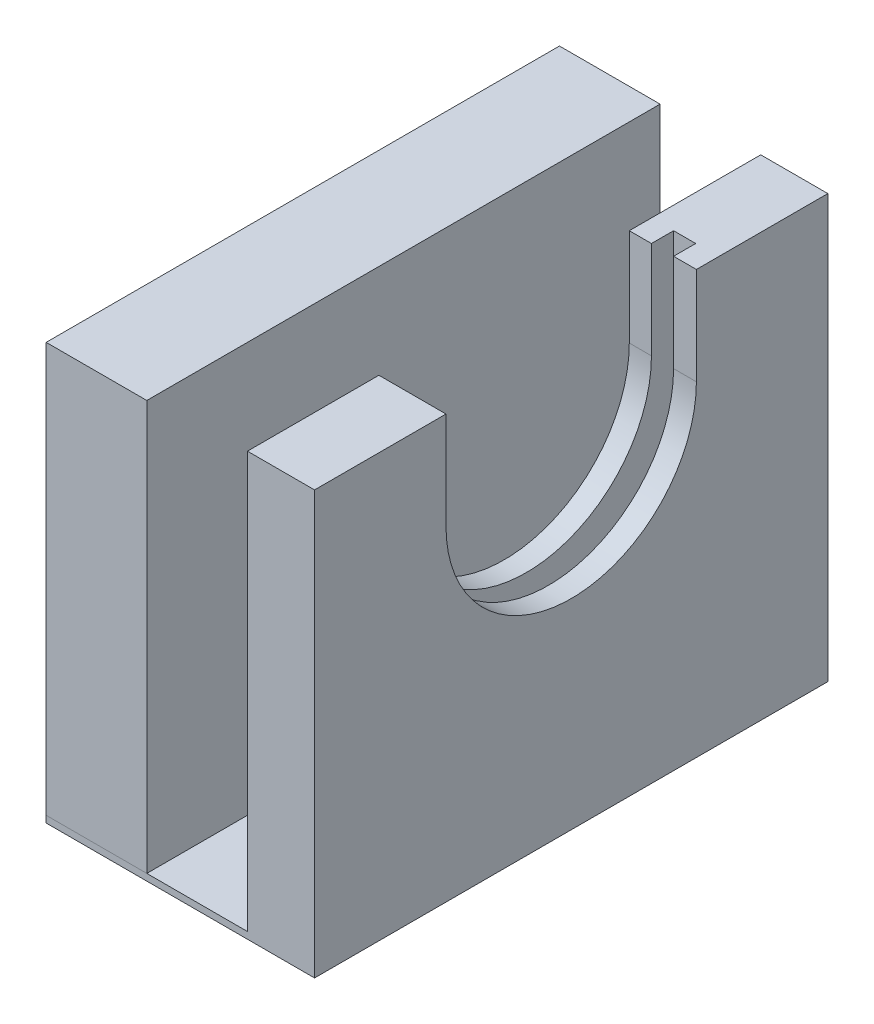
ISO-10303-21;
HEADER;
FILE_DESCRIPTION(('STEP AP214'),'2;1');
FILE_NAME('part.step','',(''),(''),'','','');
FILE_SCHEMA(('AUTOMOTIVE_DESIGN { 1 0 10303 214 1 1 1 1 }'));
ENDSEC;
DATA;
#1=APPLICATION_CONTEXT('core data for automotive mechanical design processes');
#2=APPLICATION_PROTOCOL_DEFINITION('international standard','automotive_design',2000,#1);
#3=PRODUCT_CONTEXT('',#1,'mechanical');
#4=PRODUCT('Part','Part','',(#3));
#5=PRODUCT_RELATED_PRODUCT_CATEGORY('part','',(#4));
#6=PRODUCT_DEFINITION_FORMATION('','',#4);
#7=PRODUCT_DEFINITION_CONTEXT('part definition',#1,'design');
#8=PRODUCT_DEFINITION('design','',#6,#7);
#9=PRODUCT_DEFINITION_SHAPE('','',#8);
#10=(LENGTH_UNIT() NAMED_UNIT(*) SI_UNIT(.MILLI.,.METRE.));
#11=(NAMED_UNIT(*) PLANE_ANGLE_UNIT() SI_UNIT($,.RADIAN.));
#12=(NAMED_UNIT(*) SI_UNIT($,.STERADIAN.) SOLID_ANGLE_UNIT());
#13=UNCERTAINTY_MEASURE_WITH_UNIT(LENGTH_MEASURE(1.E-05),#10,'distance_accuracy_value','');
#14=(GEOMETRIC_REPRESENTATION_CONTEXT(3) GLOBAL_UNCERTAINTY_ASSIGNED_CONTEXT((#13)) GLOBAL_UNIT_ASSIGNED_CONTEXT((#10,
#11,#12)) REPRESENTATION_CONTEXT('',''));
#15=CARTESIAN_POINT('',(0.,0.,0.));
#16=DIRECTION('',(0.,0.,1.));
#17=DIRECTION('',(1.,0.,0.));
#18=AXIS2_PLACEMENT_3D('',#15,#16,#17);
#19=CARTESIAN_POINT('',(-30.,0.,0.));
#20=DIRECTION('',(0.,-1.,0.));
#21=DIRECTION('',(0.,0.,-1.));
#22=AXIS2_PLACEMENT_3D('',#19,#20,#21);
#23=PLANE('',#22);
#24=DIRECTION('',(1.,0.,0.));
#25=VECTOR('',#24,1.);
#26=CARTESIAN_POINT('',(-30.,0.,76.5));
#27=LINE('',#26,#25);
#28=CARTESIAN_POINT('',(-30.,0.,76.5));
#29=VERTEX_POINT('',#28);
#30=CARTESIAN_POINT('',(-15.,0.,76.5));
#31=VERTEX_POINT('',#30);
#32=EDGE_CURVE('E108',#29,#31,#27,.T.);
#33=ORIENTED_EDGE('',*,*,#32,.F.);
#34=DIRECTION('',(0.,0.,1.));
#35=VECTOR('',#34,1.);
#36=CARTESIAN_POINT('',(-30.,0.,0.));
#37=LINE('',#36,#35);
#38=CARTESIAN_POINT('',(-30.,0.,0.));
#39=VERTEX_POINT('',#38);
#40=EDGE_CURVE('E12',#39,#29,#37,.T.);
#41=ORIENTED_EDGE('',*,*,#40,.F.);
#42=DIRECTION('',(1.,0.,0.));
#43=VECTOR('',#42,1.);
#44=CARTESIAN_POINT('',(-30.,0.,0.));
#45=LINE('',#44,#43);
#46=CARTESIAN_POINT('',(-15.,0.,0.));
#47=VERTEX_POINT('',#46);
#48=EDGE_CURVE('E102',#39,#47,#45,.T.);
#49=ORIENTED_EDGE('',*,*,#48,.T.);
#50=DIRECTION('',(0.,0.,1.));
#51=VECTOR('',#50,1.);
#52=CARTESIAN_POINT('',(-15.,0.,0.));
#53=LINE('',#52,#51);
#54=EDGE_CURVE('E47',#47,#31,#53,.T.);
#55=ORIENTED_EDGE('',*,*,#54,.T.);
#56=EDGE_LOOP('',(#33,#41,#49,#55));
#57=FACE_BOUND('',#56,.T.);
#58=ADVANCED_FACE('F44',(#57),#23,.T.);
#59=CARTESIAN_POINT('',(-30.,0.,0.));
#60=DIRECTION('',(-1.,0.,0.));
#61=DIRECTION('',(0.,0.,1.));
#62=AXIS2_PLACEMENT_3D('',#59,#60,#61);
#63=PLANE('',#62);
#64=DIRECTION('',(0.,-1.,0.));
#65=VECTOR('',#64,1.);
#66=CARTESIAN_POINT('',(-30.,0.,76.5));
#67=LINE('',#66,#65);
#68=CARTESIAN_POINT('',(-30.,61.0451591527197,76.5));
#69=VERTEX_POINT('',#68);
#70=EDGE_CURVE('E104',#69,#29,#67,.T.);
#71=ORIENTED_EDGE('',*,*,#70,.F.);
#72=DIRECTION('',(0.,0.,1.));
#73=VECTOR('',#72,1.);
#74=CARTESIAN_POINT('',(-30.,61.0451591527197,0.));
#75=LINE('',#74,#73);
#76=CARTESIAN_POINT('',(-30.,61.0451591527197,0.));
#77=VERTEX_POINT('',#76);
#78=EDGE_CURVE('E53',#77,#69,#75,.T.);
#79=ORIENTED_EDGE('',*,*,#78,.F.);
#80=DIRECTION('',(0.,-1.,0.));
#81=VECTOR('',#80,1.);
#82=CARTESIAN_POINT('',(-30.,0.,0.));
#83=LINE('',#82,#81);
#84=EDGE_CURVE('E99',#77,#39,#83,.T.);
#85=ORIENTED_EDGE('',*,*,#84,.T.);
#86=ORIENTED_EDGE('',*,*,#40,.T.);
#87=EDGE_LOOP('',(#71,#79,#85,#86));
#88=FACE_BOUND('',#87,.T.);
#89=ADVANCED_FACE('F118',(#88),#63,.T.);
#90=CARTESIAN_POINT('',(-30.,61.0451591527197,0.));
#91=DIRECTION('',(0.,1.,0.));
#92=DIRECTION('',(0.,0.,1.));
#93=AXIS2_PLACEMENT_3D('',#90,#91,#92);
#94=PLANE('',#93);
#95=DIRECTION('',(-1.,0.,0.));
#96=VECTOR('',#95,1.);
#97=CARTESIAN_POINT('',(-30.,61.0451591527197,76.5));
#98=LINE('',#97,#96);
#99=CARTESIAN_POINT('',(-15.,61.0451591527197,76.5));
#100=VERTEX_POINT('',#99);
#101=EDGE_CURVE('E94',#100,#69,#98,.T.);
#102=ORIENTED_EDGE('',*,*,#101,.F.);
#103=DIRECTION('',(0.,0.,1.));
#104=VECTOR('',#103,1.);
#105=CARTESIAN_POINT('',(-15.,61.0451591527197,0.));
#106=LINE('',#105,#104);
#107=CARTESIAN_POINT('',(-15.,61.0451591527197,0.));
#108=VERTEX_POINT('',#107);
#109=EDGE_CURVE('E89',#108,#100,#106,.T.);
#110=ORIENTED_EDGE('',*,*,#109,.F.);
#111=DIRECTION('',(-1.,0.,0.));
#112=VECTOR('',#111,1.);
#113=CARTESIAN_POINT('',(-30.,61.0451591527197,0.));
#114=LINE('',#113,#112);
#115=EDGE_CURVE('E92',#108,#77,#114,.T.);
#116=ORIENTED_EDGE('',*,*,#115,.T.);
#117=ORIENTED_EDGE('',*,*,#78,.T.);
#118=EDGE_LOOP('',(#102,#110,#116,#117));
#119=FACE_BOUND('',#118,.T.);
#120=ADVANCED_FACE('F91',(#119),#94,.T.);
#121=CARTESIAN_POINT('',(-15.,0.,0.));
#122=DIRECTION('',(1.,0.,0.));
#123=DIRECTION('',(0.,0.,-1.));
#124=AXIS2_PLACEMENT_3D('',#121,#122,#123);
#125=PLANE('',#124);
#126=DIRECTION('',(0.,1.,0.));
#127=VECTOR('',#126,1.);
#128=CARTESIAN_POINT('',(-15.,0.,76.5));
#129=LINE('',#128,#127);
#130=EDGE_CURVE('E111',#31,#100,#129,.T.);
#131=ORIENTED_EDGE('',*,*,#130,.F.);
#132=ORIENTED_EDGE('',*,*,#54,.F.);
#133=DIRECTION('',(0.,1.,0.));
#134=VECTOR('',#133,1.);
#135=CARTESIAN_POINT('',(-15.,0.,0.));
#136=LINE('',#135,#134);
#137=EDGE_CURVE('E98',#47,#108,#136,.T.);
#138=ORIENTED_EDGE('',*,*,#137,.T.);
#139=ORIENTED_EDGE('',*,*,#109,.T.);
#140=EDGE_LOOP('',(#131,#132,#138,#139));
#141=FACE_BOUND('',#140,.T.);
#142=ADVANCED_FACE('F101',(#141),#125,.T.);
#143=CARTESIAN_POINT('',(-15.,0.,0.));
#144=DIRECTION('',(0.,0.,1.));
#145=DIRECTION('',(1.,0.,0.));
#146=AXIS2_PLACEMENT_3D('',#143,#144,#145);
#147=PLANE('',#146);
#148=ORIENTED_EDGE('',*,*,#48,.F.);
#149=ORIENTED_EDGE('',*,*,#84,.F.);
#150=ORIENTED_EDGE('',*,*,#115,.F.);
#151=ORIENTED_EDGE('',*,*,#137,.F.);
#152=EDGE_LOOP('',(#148,#149,#150,#151));
#153=FACE_BOUND('',#152,.T.);
#154=ADVANCED_FACE('F97',(#153),#147,.F.);
#155=CARTESIAN_POINT('',(-15.,0.,76.5));
#156=DIRECTION('',(0.,0.,1.));
#157=DIRECTION('',(1.,0.,0.));
#158=AXIS2_PLACEMENT_3D('',#155,#156,#157);
#159=PLANE('',#158);
#160=ORIENTED_EDGE('',*,*,#32,.T.);
#161=ORIENTED_EDGE('',*,*,#130,.T.);
#162=ORIENTED_EDGE('',*,*,#101,.T.);
#163=ORIENTED_EDGE('',*,*,#70,.T.);
#164=EDGE_LOOP('',(#160,#161,#162,#163));
#165=FACE_BOUND('',#164,.T.);
#166=ADVANCED_FACE('F117',(#165),#159,.T.);
#167=CLOSED_SHELL('',(#58,#89,#120,#142,#154,#166));
#168=MANIFOLD_SOLID_BREP('B2',#167);
#169=CARTESIAN_POINT('',(-66.5,62.,19.59));
#170=DIRECTION('',(0.,0.,-1.));
#171=DIRECTION('',(0.,1.,0.));
#172=AXIS2_PLACEMENT_3D('',#169,#170,#171);
#173=PLANE('',#172);
#174=DIRECTION('',(1.,0.,0.));
#175=VECTOR('',#174,1.);
#176=CARTESIAN_POINT('',(-66.5,47.5,19.59));
#177=LINE('',#176,#175);
#178=CARTESIAN_POINT('',(0.,47.5,19.59));
#179=VERTEX_POINT('',#178);
#180=CARTESIAN_POINT('',(3.3,47.5,19.59));
#181=VERTEX_POINT('',#180);
#182=EDGE_CURVE('E193',#179,#181,#177,.T.);
#183=ORIENTED_EDGE('',*,*,#182,.T.);
#184=DIRECTION('',(0.,1.,0.));
#185=VECTOR('',#184,1.);
#186=CARTESIAN_POINT('',(3.3,62.,19.59));
#187=LINE('',#186,#185);
#188=CARTESIAN_POINT('',(3.3,62.,19.59));
#189=VERTEX_POINT('',#188);
#190=EDGE_CURVE('E357',#181,#189,#187,.T.);
#191=ORIENTED_EDGE('',*,*,#190,.T.);
#192=DIRECTION('',(1.,0.,0.));
#193=VECTOR('',#192,1.);
#194=CARTESIAN_POINT('',(-66.5,62.,19.59));
#195=LINE('',#194,#193);
#196=CARTESIAN_POINT('',(0.,62.,19.59));
#197=VERTEX_POINT('',#196);
#198=EDGE_CURVE('E373',#197,#189,#195,.T.);
#199=ORIENTED_EDGE('',*,*,#198,.F.);
#200=DIRECTION('',(0.,1.,0.));
#201=VECTOR('',#200,1.);
#202=CARTESIAN_POINT('',(0.,0.,19.59));
#203=LINE('',#202,#201);
#204=EDGE_CURVE('E429',#179,#197,#203,.T.);
#205=ORIENTED_EDGE('',*,*,#204,.F.);
#206=EDGE_LOOP('',(#183,#191,#199,#205));
#207=FACE_BOUND('',#206,.T.);
#208=ADVANCED_FACE('F169',(#207),#173,.F.);
#209=CARTESIAN_POINT('',(-66.5,47.5,38.25));
#210=DIRECTION('',(1.,0.,0.));
#211=DIRECTION('',(0.,0.,-1.));
#212=AXIS2_PLACEMENT_3D('',#209,#210,#211);
#213=CYLINDRICAL_SURFACE('',#212,18.66);
#214=DIRECTION('',(1.,0.,0.));
#215=VECTOR('',#214,1.);
#216=CARTESIAN_POINT('',(-66.5,47.5,56.91));
#217=LINE('',#216,#215);
#218=CARTESIAN_POINT('',(0.,47.5,56.91));
#219=VERTEX_POINT('',#218);
#220=CARTESIAN_POINT('',(3.3,47.5,56.91));
#221=VERTEX_POINT('',#220);
#222=EDGE_CURVE('E379',#219,#221,#217,.T.);
#223=ORIENTED_EDGE('',*,*,#222,.T.);
#224=CARTESIAN_POINT('',(3.3,47.5,38.25));
#225=DIRECTION('',(-1.,0.,0.));
#226=DIRECTION('',(0.,0.,1.));
#227=AXIS2_PLACEMENT_3D('',#224,#225,#226);
#228=CIRCLE('',#227,18.66);
#229=EDGE_CURVE('E42',#221,#181,#228,.F.);
#230=ORIENTED_EDGE('',*,*,#229,.T.);
#231=ORIENTED_EDGE('',*,*,#182,.F.);
#232=CARTESIAN_POINT('',(0.,47.5,38.25));
#233=DIRECTION('',(1.,0.,0.));
#234=DIRECTION('',(0.,0.,-1.));
#235=AXIS2_PLACEMENT_3D('',#232,#233,#234);
#236=CIRCLE('',#235,18.66);
#237=EDGE_CURVE('E425',#219,#179,#236,.T.);
#238=ORIENTED_EDGE('',*,*,#237,.F.);
#239=EDGE_LOOP('',(#223,#230,#231,#238));
#240=FACE_BOUND('',#239,.T.);
#241=ADVANCED_FACE('F446',(#240),#213,.F.);
#242=CARTESIAN_POINT('',(0.,62.,76.5));
#243=DIRECTION('',(0.,-1.,0.));
#244=DIRECTION('',(0.,0.,-1.));
#245=AXIS2_PLACEMENT_3D('',#242,#243,#244);
#246=PLANE('',#245);
#247=DIRECTION('',(0.,0.,-1.));
#248=VECTOR('',#247,1.);
#249=CARTESIAN_POINT('',(10.,62.,76.5));
#250=LINE('',#249,#248);
#251=CARTESIAN_POINT('',(10.,62.,76.5));
#252=VERTEX_POINT('',#251);
#253=CARTESIAN_POINT('',(10.,62.,56.91));
#254=VERTEX_POINT('',#253);
#255=EDGE_CURVE('E292',#252,#254,#250,.T.);
#256=ORIENTED_EDGE('',*,*,#255,.T.);
#257=DIRECTION('',(1.,0.,0.));
#258=VECTOR('',#257,1.);
#259=CARTESIAN_POINT('',(-66.5,62.,56.91));
#260=LINE('',#259,#258);
#261=CARTESIAN_POINT('',(0.,62.,56.91));
#262=VERTEX_POINT('',#261);
#263=EDGE_CURVE('E370',#262,#254,#260,.T.);
#264=ORIENTED_EDGE('',*,*,#263,.F.);
#265=DIRECTION('',(0.,0.,-1.));
#266=VECTOR('',#265,1.);
#267=CARTESIAN_POINT('',(0.,62.,76.5));
#268=LINE('',#267,#266);
#269=CARTESIAN_POINT('',(0.,62.,76.5));
#270=VERTEX_POINT('',#269);
#271=EDGE_CURVE('E390',#270,#262,#268,.T.);
#272=ORIENTED_EDGE('',*,*,#271,.F.);
#273=DIRECTION('',(-1.,0.,0.));
#274=VECTOR('',#273,1.);
#275=CARTESIAN_POINT('',(0.,62.,76.5));
#276=LINE('',#275,#274);
#277=EDGE_CURVE('E295',#252,#270,#276,.T.);
#278=ORIENTED_EDGE('',*,*,#277,.F.);
#279=EDGE_LOOP('',(#256,#264,#272,#278));
#280=FACE_BOUND('',#279,.T.);
#281=ADVANCED_FACE('F443',(#280),#246,.F.);
#282=CARTESIAN_POINT('',(10.,62.,76.5));
#283=DIRECTION('',(-1.,0.,0.));
#284=DIRECTION('',(0.,0.,1.));
#285=AXIS2_PLACEMENT_3D('',#282,#283,#284);
#286=PLANE('',#285);
#287=CARTESIAN_POINT('',(10.,47.5,38.25));
#288=DIRECTION('',(1.,0.,0.));
#289=DIRECTION('',(0.,0.,-1.));
#290=AXIS2_PLACEMENT_3D('',#287,#288,#289);
#291=CIRCLE('',#290,18.66);
#292=CARTESIAN_POINT('',(10.,47.5,56.91));
#293=VERTEX_POINT('',#292);
#294=CARTESIAN_POINT('',(10.,47.5,19.59));
#295=VERTEX_POINT('',#294);
#296=EDGE_CURVE('E363',#293,#295,#291,.T.);
#297=ORIENTED_EDGE('',*,*,#296,.F.);
#298=DIRECTION('',(0.,-1.,0.));
#299=VECTOR('',#298,1.);
#300=CARTESIAN_POINT('',(10.,62.,56.91));
#301=LINE('',#300,#299);
#302=EDGE_CURVE('E360',#254,#293,#301,.T.);
#303=ORIENTED_EDGE('',*,*,#302,.F.);
#304=ORIENTED_EDGE('',*,*,#255,.F.);
#305=DIRECTION('',(0.,1.,0.));
#306=VECTOR('',#305,1.);
#307=CARTESIAN_POINT('',(10.,62.,76.5));
#308=LINE('',#307,#306);
#309=CARTESIAN_POINT('',(10.,-1.,76.5));
#310=VERTEX_POINT('',#309);
#311=EDGE_CURVE('E284',#310,#252,#308,.T.);
#312=ORIENTED_EDGE('',*,*,#311,.F.);
#313=DIRECTION('',(0.,0.,1.));
#314=VECTOR('',#313,1.);
#315=CARTESIAN_POINT('',(10.,-1.,76.5));
#316=LINE('',#315,#314);
#317=CARTESIAN_POINT('',(10.,-1.,0.));
#318=VERTEX_POINT('',#317);
#319=EDGE_CURVE('E289',#318,#310,#316,.T.);
#320=ORIENTED_EDGE('',*,*,#319,.F.);
#321=DIRECTION('',(0.,1.,0.));
#322=VECTOR('',#321,1.);
#323=CARTESIAN_POINT('',(10.,62.,0.));
#324=LINE('',#323,#322);
#325=CARTESIAN_POINT('',(10.,62.,0.));
#326=VERTEX_POINT('',#325);
#327=EDGE_CURVE('E372',#318,#326,#324,.T.);
#328=ORIENTED_EDGE('',*,*,#327,.T.);
#329=CARTESIAN_POINT('',(10.,62.,19.59));
#330=VERTEX_POINT('',#329);
#331=EDGE_CURVE('E423',#330,#326,#250,.T.);
#332=ORIENTED_EDGE('',*,*,#331,.F.);
#333=DIRECTION('',(0.,1.,0.));
#334=VECTOR('',#333,1.);
#335=CARTESIAN_POINT('',(10.,62.,19.59));
#336=LINE('',#335,#334);
#337=EDGE_CURVE('E366',#295,#330,#336,.T.);
#338=ORIENTED_EDGE('',*,*,#337,.F.);
#339=EDGE_LOOP('',(#297,#303,#304,#312,#320,#328,#332,#338));
#340=FACE_BOUND('',#339,.T.);
#341=ADVANCED_FACE('F171',(#340),#286,.F.);
#342=ORIENTED_EDGE('',*,*,#198,.T.);
#343=DIRECTION('',(0.,0.,1.));
#344=VECTOR('',#343,1.);
#345=CARTESIAN_POINT('',(3.3,62.,46.395));
#346=LINE('',#345,#344);
#347=CARTESIAN_POINT('',(3.3,62.,16.29));
#348=VERTEX_POINT('',#347);
#349=EDGE_CURVE('E327',#348,#189,#346,.T.);
#350=ORIENTED_EDGE('',*,*,#349,.F.);
#351=DIRECTION('',(-1.,0.,0.));
#352=VECTOR('',#351,1.);
#353=CARTESIAN_POINT('',(-42.6153371469112,62.,16.29));
#354=LINE('',#353,#352);
#355=CARTESIAN_POINT('',(6.60000000000001,62.,16.29));
#356=VERTEX_POINT('',#355);
#357=EDGE_CURVE('E330',#356,#348,#354,.T.);
#358=ORIENTED_EDGE('',*,*,#357,.F.);
#359=DIRECTION('',(0.,0.,-1.));
#360=VECTOR('',#359,1.);
#361=CARTESIAN_POINT('',(6.60000000000001,62.,46.395));
#362=LINE('',#361,#360);
#363=CARTESIAN_POINT('',(6.60000000000001,62.,19.59));
#364=VERTEX_POINT('',#363);
#365=EDGE_CURVE('E333',#364,#356,#362,.T.);
#366=ORIENTED_EDGE('',*,*,#365,.F.);
#367=EDGE_CURVE('E376',#364,#330,#195,.T.);
#368=ORIENTED_EDGE('',*,*,#367,.T.);
#369=ORIENTED_EDGE('',*,*,#331,.T.);
#370=DIRECTION('',(-1.,0.,0.));
#371=VECTOR('',#370,1.);
#372=CARTESIAN_POINT('',(0.,62.,0.));
#373=LINE('',#372,#371);
#374=CARTESIAN_POINT('',(0.,62.,0.));
#375=VERTEX_POINT('',#374);
#376=EDGE_CURVE('E385',#326,#375,#373,.T.);
#377=ORIENTED_EDGE('',*,*,#376,.T.);
#378=EDGE_CURVE('E396',#197,#375,#268,.T.);
#379=ORIENTED_EDGE('',*,*,#378,.F.);
#380=EDGE_LOOP('',(#342,#350,#358,#366,#368,#369,#377,#379));
#381=FACE_BOUND('',#380,.T.);
#382=ADVANCED_FACE('F450',(#381),#246,.F.);
#383=CARTESIAN_POINT('',(0.,0.,76.5));
#384=DIRECTION('',(1.,0.,0.));
#385=DIRECTION('',(0.,0.,-1.));
#386=AXIS2_PLACEMENT_3D('',#383,#384,#385);
#387=PLANE('',#386);
#388=ORIENTED_EDGE('',*,*,#271,.T.);
#389=DIRECTION('',(0.,-1.,0.));
#390=VECTOR('',#389,1.);
#391=CARTESIAN_POINT('',(0.,0.,56.91));
#392=LINE('',#391,#390);
#393=EDGE_CURVE('E432',#262,#219,#392,.T.);
#394=ORIENTED_EDGE('',*,*,#393,.T.);
#395=ORIENTED_EDGE('',*,*,#237,.T.);
#396=ORIENTED_EDGE('',*,*,#204,.T.);
#397=ORIENTED_EDGE('',*,*,#378,.T.);
#398=DIRECTION('',(0.,-1.,0.));
#399=VECTOR('',#398,1.);
#400=CARTESIAN_POINT('',(0.,0.,0.));
#401=LINE('',#400,#399);
#402=CARTESIAN_POINT('',(0.,0.,0.));
#403=VERTEX_POINT('',#402);
#404=EDGE_CURVE('E296',#375,#403,#401,.T.);
#405=ORIENTED_EDGE('',*,*,#404,.T.);
#406=DIRECTION('',(0.,0.,-1.));
#407=VECTOR('',#406,1.);
#408=CARTESIAN_POINT('',(0.,0.,76.5));
#409=LINE('',#408,#407);
#410=CARTESIAN_POINT('',(0.,0.,76.5));
#411=VERTEX_POINT('',#410);
#412=EDGE_CURVE('E393',#411,#403,#409,.T.);
#413=ORIENTED_EDGE('',*,*,#412,.F.);
#414=DIRECTION('',(0.,-1.,0.));
#415=VECTOR('',#414,1.);
#416=CARTESIAN_POINT('',(0.,0.,76.5));
#417=LINE('',#416,#415);
#418=EDGE_CURVE('E383',#270,#411,#417,.T.);
#419=ORIENTED_EDGE('',*,*,#418,.F.);
#420=EDGE_LOOP('',(#388,#394,#395,#396,#397,#405,#413,#419));
#421=FACE_BOUND('',#420,.T.);
#422=ADVANCED_FACE('F406',(#421),#387,.F.);
#423=CARTESIAN_POINT('',(0.,0.,76.5));
#424=DIRECTION('',(0.,0.,-1.));
#425=DIRECTION('',(-1.,0.,0.));
#426=AXIS2_PLACEMENT_3D('',#423,#424,#425);
#427=PLANE('',#426);
#428=ORIENTED_EDGE('',*,*,#418,.T.);
#429=DIRECTION('',(-1.,0.,0.));
#430=VECTOR('',#429,1.);
#431=CARTESIAN_POINT('',(10.,0.,76.5));
#432=LINE('',#431,#430);
#433=CARTESIAN_POINT('',(-30.,0.,76.5));
#434=VERTEX_POINT('',#433);
#435=EDGE_CURVE('E324',#411,#434,#432,.T.);
#436=ORIENTED_EDGE('',*,*,#435,.T.);
#437=DIRECTION('',(0.,1.,0.));
#438=VECTOR('',#437,1.);
#439=CARTESIAN_POINT('',(-30.,-1.,76.5));
#440=LINE('',#439,#438);
#441=CARTESIAN_POINT('',(-30.,-1.,76.5));
#442=VERTEX_POINT('',#441);
#443=EDGE_CURVE('E302',#442,#434,#440,.T.);
#444=ORIENTED_EDGE('',*,*,#443,.F.);
#445=DIRECTION('',(-1.,0.,0.));
#446=VECTOR('',#445,1.);
#447=CARTESIAN_POINT('',(10.,-1.,76.5));
#448=LINE('',#447,#446);
#449=EDGE_CURVE('E299',#310,#442,#448,.T.);
#450=ORIENTED_EDGE('',*,*,#449,.F.);
#451=ORIENTED_EDGE('',*,*,#311,.T.);
#452=ORIENTED_EDGE('',*,*,#277,.T.);
#453=EDGE_LOOP('',(#428,#436,#444,#450,#451,#452));
#454=FACE_BOUND('',#453,.T.);
#455=ADVANCED_FACE('F300',(#454),#427,.F.);
#456=CARTESIAN_POINT('',(0.,0.,0.));
#457=DIRECTION('',(0.,0.,-1.));
#458=DIRECTION('',(-1.,0.,0.));
#459=AXIS2_PLACEMENT_3D('',#456,#457,#458);
#460=PLANE('',#459);
#461=ORIENTED_EDGE('',*,*,#327,.F.);
#462=DIRECTION('',(1.,0.,0.));
#463=VECTOR('',#462,1.);
#464=CARTESIAN_POINT('',(-30.,-1.,0.));
#465=LINE('',#464,#463);
#466=CARTESIAN_POINT('',(-30.,-1.,0.));
#467=VERTEX_POINT('',#466);
#468=EDGE_CURVE('E310',#467,#318,#465,.T.);
#469=ORIENTED_EDGE('',*,*,#468,.F.);
#470=DIRECTION('',(0.,1.,0.));
#471=VECTOR('',#470,1.);
#472=CARTESIAN_POINT('',(-30.,-1.,0.));
#473=LINE('',#472,#471);
#474=CARTESIAN_POINT('',(-30.,0.,0.));
#475=VERTEX_POINT('',#474);
#476=EDGE_CURVE('E319',#467,#475,#473,.T.);
#477=ORIENTED_EDGE('',*,*,#476,.T.);
#478=DIRECTION('',(1.,0.,0.));
#479=VECTOR('',#478,1.);
#480=CARTESIAN_POINT('',(-30.,0.,0.));
#481=LINE('',#480,#479);
#482=EDGE_CURVE('E311',#475,#403,#481,.T.);
#483=ORIENTED_EDGE('',*,*,#482,.T.);
#484=ORIENTED_EDGE('',*,*,#404,.F.);
#485=ORIENTED_EDGE('',*,*,#376,.F.);
#486=EDGE_LOOP('',(#461,#469,#477,#483,#484,#485));
#487=FACE_BOUND('',#486,.T.);
#488=ADVANCED_FACE('F417',(#487),#460,.T.);
#489=CARTESIAN_POINT('',(-66.5,62.,56.91));
#490=DIRECTION('',(0.,0.,1.));
#491=DIRECTION('',(1.,0.,0.));
#492=AXIS2_PLACEMENT_3D('',#489,#490,#491);
#493=PLANE('',#492);
#494=CARTESIAN_POINT('',(6.60000000000001,47.5,56.91));
#495=VERTEX_POINT('',#494);
#496=EDGE_CURVE('E369',#495,#293,#217,.T.);
#497=ORIENTED_EDGE('',*,*,#496,.F.);
#498=DIRECTION('',(0.,1.,0.));
#499=VECTOR('',#498,1.);
#500=CARTESIAN_POINT('',(6.60000000000001,-10.001,56.91));
#501=LINE('',#500,#499);
#502=CARTESIAN_POINT('',(6.60000000000001,32.9535227632255,56.91));
#503=VERTEX_POINT('',#502);
#504=EDGE_CURVE('E186',#503,#495,#501,.T.);
#505=ORIENTED_EDGE('',*,*,#504,.F.);
#506=DIRECTION('',(1.,0.,0.));
#507=VECTOR('',#506,1.);
#508=CARTESIAN_POINT('',(-66.5,32.9535227632255,56.91));
#509=LINE('',#508,#507);
#510=CARTESIAN_POINT('',(3.3,32.9535227632255,56.91));
#511=VERTEX_POINT('',#510);
#512=EDGE_CURVE('E335',#503,#511,#509,.F.);
#513=ORIENTED_EDGE('',*,*,#512,.T.);
#514=DIRECTION('',(0.,1.,0.));
#515=VECTOR('',#514,1.);
#516=CARTESIAN_POINT('',(3.3,-10.001,56.91));
#517=LINE('',#516,#515);
#518=EDGE_CURVE('E347',#511,#221,#517,.T.);
#519=ORIENTED_EDGE('',*,*,#518,.T.);
#520=ORIENTED_EDGE('',*,*,#222,.F.);
#521=ORIENTED_EDGE('',*,*,#393,.F.);
#522=ORIENTED_EDGE('',*,*,#263,.T.);
#523=ORIENTED_EDGE('',*,*,#302,.T.);
#524=EDGE_LOOP('',(#497,#505,#513,#519,#520,#521,#522,#523));
#525=FACE_BOUND('',#524,.T.);
#526=ADVANCED_FACE('F439',(#525),#493,.F.);
#527=ORIENTED_EDGE('',*,*,#367,.F.);
#528=DIRECTION('',(0.,-1.,0.));
#529=VECTOR('',#528,1.);
#530=CARTESIAN_POINT('',(6.60000000000001,62.,19.59));
#531=LINE('',#530,#529);
#532=CARTESIAN_POINT('',(6.60000000000001,47.5,19.59));
#533=VERTEX_POINT('',#532);
#534=EDGE_CURVE('E354',#364,#533,#531,.T.);
#535=ORIENTED_EDGE('',*,*,#534,.T.);
#536=EDGE_CURVE('E378',#533,#295,#177,.T.);
#537=ORIENTED_EDGE('',*,*,#536,.T.);
#538=ORIENTED_EDGE('',*,*,#337,.T.);
#539=EDGE_LOOP('',(#527,#535,#537,#538));
#540=FACE_BOUND('',#539,.T.);
#541=ADVANCED_FACE('F462',(#540),#173,.F.);
#542=ORIENTED_EDGE('',*,*,#536,.F.);
#543=CARTESIAN_POINT('',(6.60000000000001,47.5,38.25));
#544=DIRECTION('',(1.,0.,0.));
#545=DIRECTION('',(0.,0.,-1.));
#546=AXIS2_PLACEMENT_3D('',#543,#544,#545);
#547=CIRCLE('',#546,18.66);
#548=EDGE_CURVE('E178',#533,#495,#547,.F.);
#549=ORIENTED_EDGE('',*,*,#548,.T.);
#550=ORIENTED_EDGE('',*,*,#496,.T.);
#551=ORIENTED_EDGE('',*,*,#296,.T.);
#552=EDGE_LOOP('',(#542,#549,#550,#551));
#553=FACE_BOUND('',#552,.T.);
#554=ADVANCED_FACE('F437',(#553),#213,.F.);
#555=CARTESIAN_POINT('',(3.3,-10.001,46.395));
#556=DIRECTION('',(-1.,0.,0.));
#557=DIRECTION('',(0.,0.,1.));
#558=AXIS2_PLACEMENT_3D('',#555,#556,#557);
#559=PLANE('',#558);
#560=ORIENTED_EDGE('',*,*,#229,.F.);
#561=ORIENTED_EDGE('',*,*,#518,.F.);
#562=CARTESIAN_POINT('',(3.3,47.5,38.25));
#563=DIRECTION('',(-1.,0.,0.));
#564=DIRECTION('',(0.,0.,1.));
#565=AXIS2_PLACEMENT_3D('',#562,#563,#564);
#566=CIRCLE('',#565,23.66);
#567=CARTESIAN_POINT('',(3.3,38.6935251093301,16.29));
#568=VERTEX_POINT('',#567);
#569=EDGE_CURVE('E344',#568,#511,#566,.T.);
#570=ORIENTED_EDGE('',*,*,#569,.F.);
#571=DIRECTION('',(0.,1.,0.));
#572=VECTOR('',#571,1.);
#573=CARTESIAN_POINT('',(3.3,-10.001,16.29));
#574=LINE('',#573,#572);
#575=EDGE_CURVE('E338',#568,#348,#574,.T.);
#576=ORIENTED_EDGE('',*,*,#575,.T.);
#577=ORIENTED_EDGE('',*,*,#349,.T.);
#578=ORIENTED_EDGE('',*,*,#190,.F.);
#579=EDGE_LOOP('',(#560,#561,#570,#576,#577,#578));
#580=FACE_BOUND('',#579,.T.);
#581=ADVANCED_FACE('F454',(#580),#559,.F.);
#582=CARTESIAN_POINT('',(6.60000000000001,-10.001,46.395));
#583=DIRECTION('',(1.,0.,0.));
#584=DIRECTION('',(0.,0.,-1.));
#585=AXIS2_PLACEMENT_3D('',#582,#583,#584);
#586=PLANE('',#585);
#587=ORIENTED_EDGE('',*,*,#365,.T.);
#588=DIRECTION('',(0.,1.,0.));
#589=VECTOR('',#588,1.);
#590=CARTESIAN_POINT('',(6.60000000000001,-10.001,16.29));
#591=LINE('',#590,#589);
#592=CARTESIAN_POINT('',(6.60000000000001,38.6935251093301,16.29));
#593=VERTEX_POINT('',#592);
#594=EDGE_CURVE('E342',#593,#356,#591,.T.);
#595=ORIENTED_EDGE('',*,*,#594,.F.);
#596=CARTESIAN_POINT('',(6.60000000000001,47.5,38.25));
#597=DIRECTION('',(1.,0.,0.));
#598=DIRECTION('',(0.,0.,-1.));
#599=AXIS2_PLACEMENT_3D('',#596,#597,#598);
#600=CIRCLE('',#599,23.66);
#601=EDGE_CURVE('E339',#503,#593,#600,.T.);
#602=ORIENTED_EDGE('',*,*,#601,.F.);
#603=ORIENTED_EDGE('',*,*,#504,.T.);
#604=ORIENTED_EDGE('',*,*,#548,.F.);
#605=ORIENTED_EDGE('',*,*,#534,.F.);
#606=EDGE_LOOP('',(#587,#595,#602,#603,#604,#605));
#607=FACE_BOUND('',#606,.T.);
#608=ADVANCED_FACE('F459',(#607),#586,.F.);
#609=CARTESIAN_POINT('',(-66.5,47.5,38.25));
#610=DIRECTION('',(1.,0.,0.));
#611=DIRECTION('',(0.,0.,-1.));
#612=AXIS2_PLACEMENT_3D('',#609,#610,#611);
#613=CYLINDRICAL_SURFACE('',#612,23.66);
#614=ORIENTED_EDGE('',*,*,#601,.T.);
#615=DIRECTION('',(1.,0.,0.));
#616=VECTOR('',#615,1.);
#617=CARTESIAN_POINT('',(-66.5,38.6935251093301,16.29));
#618=LINE('',#617,#616);
#619=EDGE_CURVE('E329',#593,#568,#618,.F.);
#620=ORIENTED_EDGE('',*,*,#619,.T.);
#621=ORIENTED_EDGE('',*,*,#569,.T.);
#622=ORIENTED_EDGE('',*,*,#512,.F.);
#623=EDGE_LOOP('',(#614,#620,#621,#622));
#624=FACE_BOUND('',#623,.T.);
#625=ADVANCED_FACE('F541',(#624),#613,.F.);
#626=CARTESIAN_POINT('',(-42.6153371469112,-10.001,16.29));
#627=DIRECTION('',(0.,0.,-1.));
#628=DIRECTION('',(-1.,0.,0.));
#629=AXIS2_PLACEMENT_3D('',#626,#627,#628);
#630=PLANE('',#629);
#631=ORIENTED_EDGE('',*,*,#594,.T.);
#632=ORIENTED_EDGE('',*,*,#357,.T.);
#633=ORIENTED_EDGE('',*,*,#575,.F.);
#634=ORIENTED_EDGE('',*,*,#619,.F.);
#635=EDGE_LOOP('',(#631,#632,#633,#634));
#636=FACE_BOUND('',#635,.T.);
#637=ADVANCED_FACE('F457',(#636),#630,.F.);
#638=CARTESIAN_POINT('',(10.,0.,0.));
#639=DIRECTION('',(0.,-1.,0.));
#640=DIRECTION('',(0.,0.,-1.));
#641=AXIS2_PLACEMENT_3D('',#638,#639,#640);
#642=PLANE('',#641);
#643=ORIENTED_EDGE('',*,*,#435,.F.);
#644=ORIENTED_EDGE('',*,*,#412,.T.);
#645=ORIENTED_EDGE('',*,*,#482,.F.);
#646=DIRECTION('',(0.,0.,-1.));
#647=VECTOR('',#646,1.);
#648=CARTESIAN_POINT('',(-30.,0.,76.5));
#649=LINE('',#648,#647);
#650=EDGE_CURVE('E314',#434,#475,#649,.T.);
#651=ORIENTED_EDGE('',*,*,#650,.F.);
#652=EDGE_LOOP('',(#643,#644,#645,#651));
#653=FACE_BOUND('',#652,.T.);
#654=ADVANCED_FACE('F411',(#653),#642,.F.);
#655=CARTESIAN_POINT('',(-30.,-1.,76.5));
#656=DIRECTION('',(1.,0.,0.));
#657=DIRECTION('',(0.,0.,-1.));
#658=AXIS2_PLACEMENT_3D('',#655,#656,#657);
#659=PLANE('',#658);
#660=ORIENTED_EDGE('',*,*,#650,.T.);
#661=ORIENTED_EDGE('',*,*,#476,.F.);
#662=DIRECTION('',(0.,0.,-1.));
#663=VECTOR('',#662,1.);
#664=CARTESIAN_POINT('',(-30.,-1.,76.5));
#665=LINE('',#664,#663);
#666=EDGE_CURVE('E305',#442,#467,#665,.T.);
#667=ORIENTED_EDGE('',*,*,#666,.F.);
#668=ORIENTED_EDGE('',*,*,#443,.T.);
#669=EDGE_LOOP('',(#660,#661,#667,#668));
#670=FACE_BOUND('',#669,.T.);
#671=ADVANCED_FACE('F415',(#670),#659,.F.);
#672=CARTESIAN_POINT('',(10.,-1.,0.));
#673=DIRECTION('',(0.,-1.,0.));
#674=DIRECTION('',(0.,0.,-1.));
#675=AXIS2_PLACEMENT_3D('',#672,#673,#674);
#676=PLANE('',#675);
#677=ORIENTED_EDGE('',*,*,#319,.T.);
#678=ORIENTED_EDGE('',*,*,#449,.T.);
#679=ORIENTED_EDGE('',*,*,#666,.T.);
#680=ORIENTED_EDGE('',*,*,#468,.T.);
#681=EDGE_LOOP('',(#677,#678,#679,#680));
#682=FACE_BOUND('',#681,.T.);
#683=ADVANCED_FACE('F308',(#682),#676,.T.);
#684=CLOSED_SHELL('',(#208,#241,#281,#341,#382,#422,#455,#488,#526,#541,#554,#581,#608,#625,
#637,#654,#671,#683));
#685=MANIFOLD_SOLID_BREP('B6',#684);
#686=ADVANCED_BREP_SHAPE_REPRESENTATION('',(#18,#168,#685),#14);
#687=SHAPE_DEFINITION_REPRESENTATION(#9,#686);
ENDSEC;
END-ISO-10303-21;
